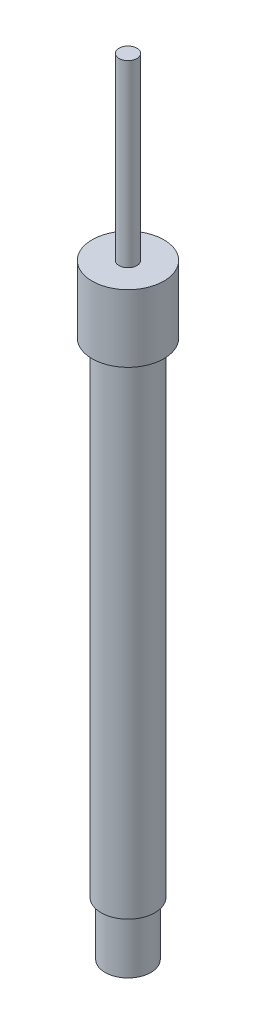
ISO-10303-21;
HEADER;
FILE_DESCRIPTION(('STEP AP214'),'2;1');
FILE_NAME('part.step','',(''),(''),'','','');
FILE_SCHEMA(('AUTOMOTIVE_DESIGN { 1 0 10303 214 1 1 1 1 }'));
ENDSEC;
DATA;
#1=APPLICATION_CONTEXT('core data for automotive mechanical design processes');
#2=APPLICATION_PROTOCOL_DEFINITION('international standard','automotive_design',2000,#1);
#3=PRODUCT_CONTEXT('',#1,'mechanical');
#4=PRODUCT('Part','Part','',(#3));
#5=PRODUCT_RELATED_PRODUCT_CATEGORY('part','',(#4));
#6=PRODUCT_DEFINITION_FORMATION('','',#4);
#7=PRODUCT_DEFINITION_CONTEXT('part definition',#1,'design');
#8=PRODUCT_DEFINITION('design','',#6,#7);
#9=PRODUCT_DEFINITION_SHAPE('','',#8);
#10=(LENGTH_UNIT() NAMED_UNIT(*) SI_UNIT(.MILLI.,.METRE.));
#11=(NAMED_UNIT(*) PLANE_ANGLE_UNIT() SI_UNIT($,.RADIAN.));
#12=(NAMED_UNIT(*) SI_UNIT($,.STERADIAN.) SOLID_ANGLE_UNIT());
#13=UNCERTAINTY_MEASURE_WITH_UNIT(LENGTH_MEASURE(1.E-05),#10,'distance_accuracy_value','');
#14=(GEOMETRIC_REPRESENTATION_CONTEXT(3) GLOBAL_UNCERTAINTY_ASSIGNED_CONTEXT((#13)) GLOBAL_UNIT_ASSIGNED_CONTEXT((#10,
#11,#12)) REPRESENTATION_CONTEXT('',''));
#15=CARTESIAN_POINT('',(0.,0.,0.));
#16=DIRECTION('',(0.,0.,1.));
#17=DIRECTION('',(1.,0.,0.));
#18=AXIS2_PLACEMENT_3D('',#15,#16,#17);
#19=CARTESIAN_POINT('',(0.,12.,0.));
#20=DIRECTION('',(0.,-1.,0.));
#21=DIRECTION('',(0.,0.,-1.));
#22=AXIS2_PLACEMENT_3D('',#19,#20,#21);
#23=CYLINDRICAL_SURFACE('',#22,5.1);
#24=CARTESIAN_POINT('',(0.,12.,0.));
#25=DIRECTION('',(0.,1.,0.));
#26=DIRECTION('',(0.,0.,1.));
#27=AXIS2_PLACEMENT_3D('',#24,#25,#26);
#28=CIRCLE('',#27,5.1);
#29=CARTESIAN_POINT('',(0.,12.,5.1));
#30=VERTEX_POINT('',#29);
#31=EDGE_CURVE('E54',#30,#30,#28,.T.);
#32=ORIENTED_EDGE('',*,*,#31,.F.);
#33=EDGE_LOOP('',(#32));
#34=FACE_BOUND('',#33,.T.);
#35=CARTESIAN_POINT('',(0.,0.,0.));
#36=DIRECTION('',(0.,1.,0.));
#37=DIRECTION('',(0.,0.,1.));
#38=AXIS2_PLACEMENT_3D('',#35,#36,#37);
#39=CIRCLE('',#38,5.1);
#40=CARTESIAN_POINT('',(0.,0.,5.1));
#41=VERTEX_POINT('',#40);
#42=EDGE_CURVE('E49',#41,#41,#39,.T.);
#43=ORIENTED_EDGE('',*,*,#42,.T.);
#44=EDGE_LOOP('',(#43));
#45=FACE_BOUND('',#44,.T.);
#46=ADVANCED_FACE('F50',(#34,#45),#23,.T.);
#47=CARTESIAN_POINT('',(0.,0.,0.));
#48=DIRECTION('',(0.,1.,0.));
#49=DIRECTION('',(0.,0.,1.));
#50=AXIS2_PLACEMENT_3D('',#47,#48,#49);
#51=PLANE('',#50);
#52=ORIENTED_EDGE('',*,*,#42,.F.);
#53=EDGE_LOOP('',(#52));
#54=FACE_BOUND('',#53,.T.);
#55=ADVANCED_FACE('F96',(#54),#51,.F.);
#56=CARTESIAN_POINT('',(0.,120.,0.));
#57=DIRECTION('',(0.,-1.,0.));
#58=DIRECTION('',(0.,0.,-1.));
#59=AXIS2_PLACEMENT_3D('',#56,#57,#58);
#60=CYLINDRICAL_SURFACE('',#59,6.);
#61=CARTESIAN_POINT('',(0.,120.,0.));
#62=DIRECTION('',(0.,1.,0.));
#63=DIRECTION('',(0.,0.,1.));
#64=AXIS2_PLACEMENT_3D('',#61,#62,#63);
#65=CIRCLE('',#64,6.);
#66=CARTESIAN_POINT('',(0.,120.,6.));
#67=VERTEX_POINT('',#66);
#68=EDGE_CURVE('E71',#67,#67,#65,.T.);
#69=ORIENTED_EDGE('',*,*,#68,.F.);
#70=EDGE_LOOP('',(#69));
#71=FACE_BOUND('',#70,.T.);
#72=CARTESIAN_POINT('',(0.,12.,0.));
#73=DIRECTION('',(0.,1.,0.));
#74=DIRECTION('',(0.,0.,1.));
#75=AXIS2_PLACEMENT_3D('',#72,#73,#74);
#76=CIRCLE('',#75,6.);
#77=CARTESIAN_POINT('',(0.,12.,6.));
#78=VERTEX_POINT('',#77);
#79=EDGE_CURVE('E69',#78,#78,#76,.T.);
#80=ORIENTED_EDGE('',*,*,#79,.T.);
#81=EDGE_LOOP('',(#80));
#82=FACE_BOUND('',#81,.T.);
#83=ADVANCED_FACE('F82',(#71,#82),#60,.T.);
#84=CARTESIAN_POINT('',(0.,12.,0.));
#85=DIRECTION('',(0.,1.,0.));
#86=DIRECTION('',(0.,0.,1.));
#87=AXIS2_PLACEMENT_3D('',#84,#85,#86);
#88=PLANE('',#87);
#89=ORIENTED_EDGE('',*,*,#31,.T.);
#90=EDGE_LOOP('',(#89));
#91=FACE_BOUND('',#90,.T.);
#92=ORIENTED_EDGE('',*,*,#79,.F.);
#93=EDGE_LOOP('',(#92));
#94=FACE_BOUND('',#93,.T.);
#95=ADVANCED_FACE('F84',(#91,#94),#88,.F.);
#96=CARTESIAN_POINT('',(0.,135.,0.));
#97=DIRECTION('',(0.,-1.,0.));
#98=DIRECTION('',(0.,0.,-1.));
#99=AXIS2_PLACEMENT_3D('',#96,#97,#98);
#100=CYLINDRICAL_SURFACE('',#99,8.);
#101=CARTESIAN_POINT('',(0.,135.,0.));
#102=DIRECTION('',(0.,1.,0.));
#103=DIRECTION('',(0.,0.,1.));
#104=AXIS2_PLACEMENT_3D('',#101,#102,#103);
#105=CIRCLE('',#104,8.);
#106=CARTESIAN_POINT('',(0.,135.,8.));
#107=VERTEX_POINT('',#106);
#108=EDGE_CURVE('E65',#107,#107,#105,.T.);
#109=ORIENTED_EDGE('',*,*,#108,.F.);
#110=EDGE_LOOP('',(#109));
#111=FACE_BOUND('',#110,.T.);
#112=CARTESIAN_POINT('',(0.,120.,0.));
#113=DIRECTION('',(0.,1.,0.));
#114=DIRECTION('',(0.,0.,1.));
#115=AXIS2_PLACEMENT_3D('',#112,#113,#114);
#116=CIRCLE('',#115,8.);
#117=CARTESIAN_POINT('',(0.,120.,8.));
#118=VERTEX_POINT('',#117);
#119=EDGE_CURVE('E66',#118,#118,#116,.T.);
#120=ORIENTED_EDGE('',*,*,#119,.T.);
#121=EDGE_LOOP('',(#120));
#122=FACE_BOUND('',#121,.T.);
#123=ADVANCED_FACE('F83',(#111,#122),#100,.T.);
#124=CARTESIAN_POINT('',(0.,135.,0.));
#125=DIRECTION('',(0.,1.,0.));
#126=DIRECTION('',(0.,0.,1.));
#127=AXIS2_PLACEMENT_3D('',#124,#125,#126);
#128=PLANE('',#127);
#129=CARTESIAN_POINT('',(0.,135.,0.));
#130=DIRECTION('',(0.,1.,0.));
#131=DIRECTION('',(0.,0.,1.));
#132=AXIS2_PLACEMENT_3D('',#129,#130,#131);
#133=CIRCLE('',#132,2.);
#134=CARTESIAN_POINT('',(0.,135.,2.));
#135=VERTEX_POINT('',#134);
#136=EDGE_CURVE('E10',#135,#135,#133,.T.);
#137=ORIENTED_EDGE('',*,*,#136,.F.);
#138=EDGE_LOOP('',(#137));
#139=FACE_BOUND('',#138,.T.);
#140=ORIENTED_EDGE('',*,*,#108,.T.);
#141=EDGE_LOOP('',(#140));
#142=FACE_BOUND('',#141,.T.);
#143=ADVANCED_FACE('F91',(#139,#142),#128,.T.);
#144=CARTESIAN_POINT('',(0.,120.,0.));
#145=DIRECTION('',(0.,1.,0.));
#146=DIRECTION('',(0.,0.,1.));
#147=AXIS2_PLACEMENT_3D('',#144,#145,#146);
#148=PLANE('',#147);
#149=ORIENTED_EDGE('',*,*,#68,.T.);
#150=EDGE_LOOP('',(#149));
#151=FACE_BOUND('',#150,.T.);
#152=ORIENTED_EDGE('',*,*,#119,.F.);
#153=EDGE_LOOP('',(#152));
#154=FACE_BOUND('',#153,.T.);
#155=ADVANCED_FACE('F122',(#151,#154),#148,.F.);
#156=CARTESIAN_POINT('',(0.,175.,0.));
#157=DIRECTION('',(0.,-1.,0.));
#158=DIRECTION('',(0.,0.,-1.));
#159=AXIS2_PLACEMENT_3D('',#156,#157,#158);
#160=CYLINDRICAL_SURFACE('',#159,2.);
#161=CARTESIAN_POINT('',(0.,175.,0.));
#162=DIRECTION('',(0.,1.,0.));
#163=DIRECTION('',(0.,0.,1.));
#164=AXIS2_PLACEMENT_3D('',#161,#162,#163);
#165=CIRCLE('',#164,2.);
#166=CARTESIAN_POINT('',(0.,175.,2.));
#167=VERTEX_POINT('',#166);
#168=EDGE_CURVE('E62',#167,#167,#165,.T.);
#169=ORIENTED_EDGE('',*,*,#168,.F.);
#170=EDGE_LOOP('',(#169));
#171=FACE_BOUND('',#170,.T.);
#172=ORIENTED_EDGE('',*,*,#136,.T.);
#173=EDGE_LOOP('',(#172));
#174=FACE_BOUND('',#173,.T.);
#175=ADVANCED_FACE('F129',(#171,#174),#160,.T.);
#176=CARTESIAN_POINT('',(0.,175.,0.));
#177=DIRECTION('',(0.,1.,0.));
#178=DIRECTION('',(0.,0.,1.));
#179=AXIS2_PLACEMENT_3D('',#176,#177,#178);
#180=PLANE('',#179);
#181=ORIENTED_EDGE('',*,*,#168,.T.);
#182=EDGE_LOOP('',(#181));
#183=FACE_BOUND('',#182,.T.);
#184=ADVANCED_FACE('F140',(#183),#180,.T.);
#185=CLOSED_SHELL('',(#46,#55,#83,#95,#123,#143,#155,#175,#184));
#186=MANIFOLD_SOLID_BREP('B2',#185);
#187=ADVANCED_BREP_SHAPE_REPRESENTATION('',(#18,#186),#14);
#188=SHAPE_DEFINITION_REPRESENTATION(#9,#187);
ENDSEC;
END-ISO-10303-21;
